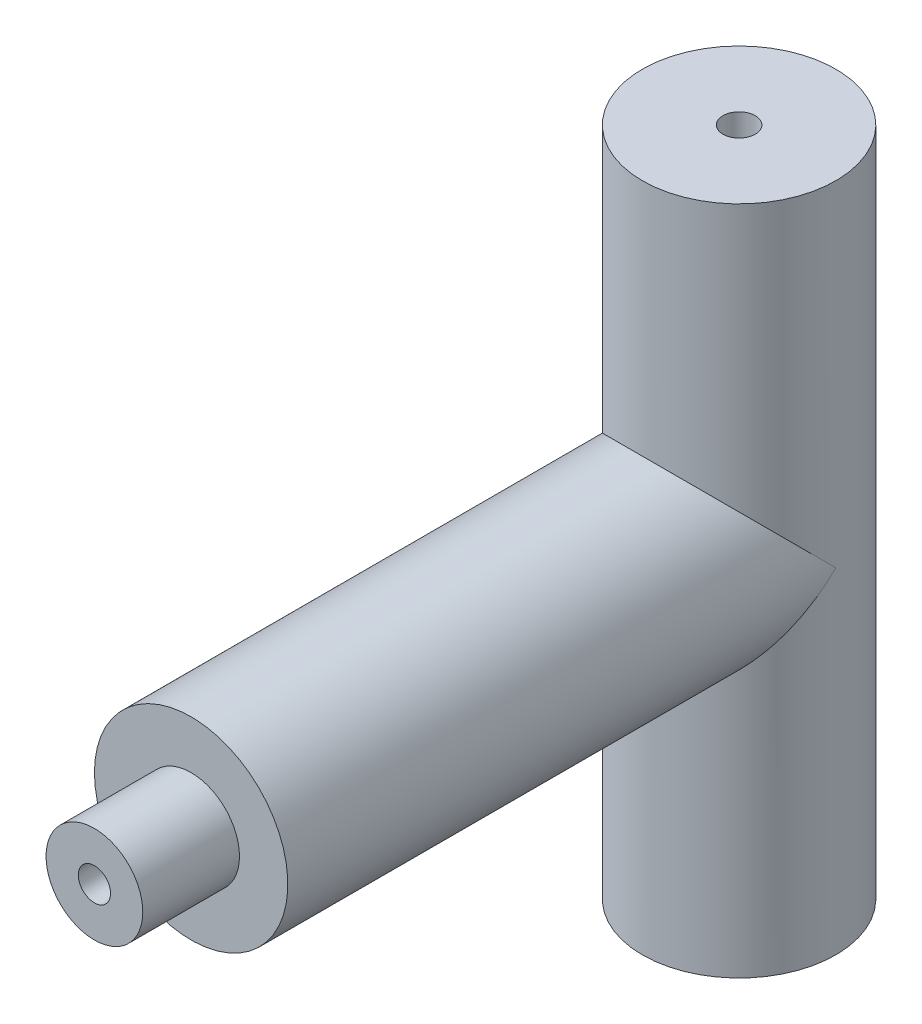
ISO-10303-21;
HEADER;
FILE_DESCRIPTION(('STEP AP214'),'2;1');
FILE_NAME('part.step','',(''),(''),'','','');
FILE_SCHEMA(('AUTOMOTIVE_DESIGN { 1 0 10303 214 1 1 1 1 }'));
ENDSEC;
DATA;
#1=APPLICATION_CONTEXT('core data for automotive mechanical design processes');
#2=APPLICATION_PROTOCOL_DEFINITION('international standard','automotive_design',2000,#1);
#3=PRODUCT_CONTEXT('',#1,'mechanical');
#4=PRODUCT('Part','Part','',(#3));
#5=PRODUCT_RELATED_PRODUCT_CATEGORY('part','',(#4));
#6=PRODUCT_DEFINITION_FORMATION('','',#4);
#7=PRODUCT_DEFINITION_CONTEXT('part definition',#1,'design');
#8=PRODUCT_DEFINITION('design','',#6,#7);
#9=PRODUCT_DEFINITION_SHAPE('','',#8);
#10=(LENGTH_UNIT() NAMED_UNIT(*) SI_UNIT(.MILLI.,.METRE.));
#11=(NAMED_UNIT(*) PLANE_ANGLE_UNIT() SI_UNIT($,.RADIAN.));
#12=(NAMED_UNIT(*) SI_UNIT($,.STERADIAN.) SOLID_ANGLE_UNIT());
#13=UNCERTAINTY_MEASURE_WITH_UNIT(LENGTH_MEASURE(1.E-05),#10,'distance_accuracy_value','');
#14=(GEOMETRIC_REPRESENTATION_CONTEXT(3) GLOBAL_UNCERTAINTY_ASSIGNED_CONTEXT((#13)) GLOBAL_UNIT_ASSIGNED_CONTEXT((#10,
#11,#12)) REPRESENTATION_CONTEXT('',''));
#15=CARTESIAN_POINT('',(0.,0.,0.));
#16=DIRECTION('',(0.,0.,1.));
#17=DIRECTION('',(1.,0.,0.));
#18=AXIS2_PLACEMENT_3D('',#15,#16,#17);
#19=CARTESIAN_POINT('',(0.,0.,-115.));
#20=DIRECTION('',(0.,0.,1.));
#21=DIRECTION('',(1.,0.,0.));
#22=AXIS2_PLACEMENT_3D('',#19,#20,#21);
#23=CYLINDRICAL_SURFACE('',#22,15.);
#24=CARTESIAN_POINT('',(0.,0.,-15.));
#25=DIRECTION('',(0.,0.,-1.));
#26=DIRECTION('',(-1.,0.,0.));
#27=AXIS2_PLACEMENT_3D('',#24,#25,#26);
#28=CIRCLE('',#27,15.);
#29=CARTESIAN_POINT('',(-15.,0.,-15.));
#30=VERTEX_POINT('',#29);
#31=EDGE_CURVE('E63',#30,#30,#28,.T.);
#32=ORIENTED_EDGE('',*,*,#31,.T.);
#33=EDGE_LOOP('',(#32));
#34=FACE_BOUND('',#33,.T.);
#35=CARTESIAN_POINT('',(0.,0.,-100.));
#36=DIRECTION('',(0.,-0.707106781186547,0.707106781186548));
#37=DIRECTION('',(0.,0.707106781186547,0.707106781186548));
#38=AXIS2_PLACEMENT_3D('',#35,#36,#37);
#39=ELLIPSE('',#38,21.2132034355964,15.);
#40=CARTESIAN_POINT('',(-15.,0.,-100.));
#41=VERTEX_POINT('',#40);
#42=CARTESIAN_POINT('',(15.,0.,-100.));
#43=VERTEX_POINT('',#42);
#44=EDGE_CURVE('E11',#41,#43,#39,.F.);
#45=ORIENTED_EDGE('',*,*,#44,.F.);
#46=CARTESIAN_POINT('',(0.,0.,-100.));
#47=DIRECTION('',(0.,0.707106781186547,0.707106781186548));
#48=DIRECTION('',(0.,-0.707106781186547,0.707106781186548));
#49=AXIS2_PLACEMENT_3D('',#46,#47,#48);
#50=ELLIPSE('',#49,21.2132034355964,15.);
#51=EDGE_CURVE('E45',#43,#41,#50,.F.);
#52=ORIENTED_EDGE('',*,*,#51,.F.);
#53=EDGE_LOOP('',(#45,#52));
#54=FACE_BOUND('',#53,.T.);
#55=ADVANCED_FACE('F37',(#34,#54),#23,.T.);
#56=CARTESIAN_POINT('',(0.,0.,-15.));
#57=DIRECTION('',(0.,0.,1.));
#58=DIRECTION('',(1.,0.,0.));
#59=AXIS2_PLACEMENT_3D('',#56,#57,#58);
#60=CYLINDRICAL_SURFACE('',#59,7.5);
#61=CARTESIAN_POINT('',(0.,0.,-15.));
#62=DIRECTION('',(0.,0.,1.));
#63=DIRECTION('',(1.,0.,0.));
#64=AXIS2_PLACEMENT_3D('',#61,#62,#63);
#65=CIRCLE('',#64,7.5);
#66=CARTESIAN_POINT('',(7.5,0.,-15.));
#67=VERTEX_POINT('',#66);
#68=EDGE_CURVE('E59',#67,#67,#65,.T.);
#69=ORIENTED_EDGE('',*,*,#68,.T.);
#70=EDGE_LOOP('',(#69));
#71=FACE_BOUND('',#70,.T.);
#72=CARTESIAN_POINT('',(0.,0.,0.));
#73=DIRECTION('',(0.,0.,1.));
#74=DIRECTION('',(1.,0.,0.));
#75=AXIS2_PLACEMENT_3D('',#72,#73,#74);
#76=CIRCLE('',#75,7.5);
#77=CARTESIAN_POINT('',(7.5,0.,0.));
#78=VERTEX_POINT('',#77);
#79=EDGE_CURVE('E54',#78,#78,#76,.T.);
#80=ORIENTED_EDGE('',*,*,#79,.F.);
#81=EDGE_LOOP('',(#80));
#82=FACE_BOUND('',#81,.T.);
#83=ADVANCED_FACE('F39',(#71,#82),#60,.T.);
#84=CARTESIAN_POINT('',(0.,0.,0.));
#85=DIRECTION('',(0.,0.,1.));
#86=DIRECTION('',(1.,0.,0.));
#87=AXIS2_PLACEMENT_3D('',#84,#85,#86);
#88=PLANE('',#87);
#89=CARTESIAN_POINT('',(0.,0.,0.));
#90=DIRECTION('',(0.,0.,1.));
#91=DIRECTION('',(1.,0.,0.));
#92=AXIS2_PLACEMENT_3D('',#89,#90,#91);
#93=CIRCLE('',#92,2.5);
#94=CARTESIAN_POINT('',(2.5,0.,0.));
#95=VERTEX_POINT('',#94);
#96=EDGE_CURVE('E62',#95,#95,#93,.T.);
#97=ORIENTED_EDGE('',*,*,#96,.F.);
#98=EDGE_LOOP('',(#97));
#99=FACE_BOUND('',#98,.T.);
#100=ORIENTED_EDGE('',*,*,#79,.T.);
#101=EDGE_LOOP('',(#100));
#102=FACE_BOUND('',#101,.T.);
#103=ADVANCED_FACE('F108',(#99,#102),#88,.T.);
#104=CARTESIAN_POINT('',(0.,0.,-5.));
#105=DIRECTION('',(0.,0.,1.));
#106=DIRECTION('',(1.,0.,0.));
#107=AXIS2_PLACEMENT_3D('',#104,#105,#106);
#108=CYLINDRICAL_SURFACE('',#107,2.5);
#109=CARTESIAN_POINT('',(0.,0.,-5.));
#110=DIRECTION('',(0.,0.,1.));
#111=DIRECTION('',(1.,0.,0.));
#112=AXIS2_PLACEMENT_3D('',#109,#110,#111);
#113=CIRCLE('',#112,2.5);
#114=CARTESIAN_POINT('',(2.5,0.,-5.));
#115=VERTEX_POINT('',#114);
#116=EDGE_CURVE('E56',#115,#115,#113,.T.);
#117=ORIENTED_EDGE('',*,*,#116,.F.);
#118=EDGE_LOOP('',(#117));
#119=FACE_BOUND('',#118,.T.);
#120=ORIENTED_EDGE('',*,*,#96,.T.);
#121=EDGE_LOOP('',(#120));
#122=FACE_BOUND('',#121,.T.);
#123=ADVANCED_FACE('F117',(#119,#122),#108,.F.);
#124=CARTESIAN_POINT('',(0.,0.,-5.));
#125=DIRECTION('',(0.,0.,1.));
#126=DIRECTION('',(1.,0.,0.));
#127=AXIS2_PLACEMENT_3D('',#124,#125,#126);
#128=PLANE('',#127);
#129=ORIENTED_EDGE('',*,*,#116,.T.);
#130=EDGE_LOOP('',(#129));
#131=FACE_BOUND('',#130,.T.);
#132=ADVANCED_FACE('F114',(#131),#128,.T.);
#133=CARTESIAN_POINT('',(0.,0.,-15.));
#134=DIRECTION('',(0.,0.,-1.));
#135=DIRECTION('',(-1.,0.,0.));
#136=AXIS2_PLACEMENT_3D('',#133,#134,#135);
#137=PLANE('',#136);
#138=ORIENTED_EDGE('',*,*,#68,.F.);
#139=EDGE_LOOP('',(#138));
#140=FACE_BOUND('',#139,.T.);
#141=ORIENTED_EDGE('',*,*,#31,.F.);
#142=EDGE_LOOP('',(#141));
#143=FACE_BOUND('',#142,.T.);
#144=ADVANCED_FACE('F112',(#140,#143),#137,.F.);
#145=CARTESIAN_POINT('',(0.,-52.,-100.));
#146=DIRECTION('',(0.,1.,0.));
#147=DIRECTION('',(0.,0.,1.));
#148=AXIS2_PLACEMENT_3D('',#145,#146,#147);
#149=PLANE('',#148);
#150=CARTESIAN_POINT('',(0.,-52.,-100.));
#151=DIRECTION('',(0.,-1.,0.));
#152=DIRECTION('',(0.,0.,-1.));
#153=AXIS2_PLACEMENT_3D('',#150,#151,#152);
#154=CIRCLE('',#153,2.5);
#155=CARTESIAN_POINT('',(0.,-52.,-102.5));
#156=VERTEX_POINT('',#155);
#157=EDGE_CURVE('E77',#156,#156,#154,.T.);
#158=ORIENTED_EDGE('',*,*,#157,.F.);
#159=EDGE_LOOP('',(#158));
#160=FACE_BOUND('',#159,.T.);
#161=CARTESIAN_POINT('',(0.,-52.,-100.));
#162=DIRECTION('',(0.,1.,0.));
#163=DIRECTION('',(0.,0.,1.));
#164=AXIS2_PLACEMENT_3D('',#161,#162,#163);
#165=CIRCLE('',#164,15.);
#166=CARTESIAN_POINT('',(0.,-52.,-85.));
#167=VERTEX_POINT('',#166);
#168=EDGE_CURVE('E71',#167,#167,#165,.T.);
#169=ORIENTED_EDGE('',*,*,#168,.F.);
#170=EDGE_LOOP('',(#169));
#171=FACE_BOUND('',#170,.T.);
#172=ADVANCED_FACE('F144',(#160,#171),#149,.F.);
#173=CARTESIAN_POINT('',(0.,-52.,-100.));
#174=DIRECTION('',(0.,1.,0.));
#175=DIRECTION('',(0.,0.,1.));
#176=AXIS2_PLACEMENT_3D('',#173,#174,#175);
#177=CYLINDRICAL_SURFACE('',#176,15.);
#178=ORIENTED_EDGE('',*,*,#44,.T.);
#179=ORIENTED_EDGE('',*,*,#51,.T.);
#180=EDGE_LOOP('',(#178,#179));
#181=FACE_BOUND('',#180,.T.);
#182=CARTESIAN_POINT('',(0.,52.,-100.));
#183=DIRECTION('',(0.,1.,0.));
#184=DIRECTION('',(0.,0.,1.));
#185=AXIS2_PLACEMENT_3D('',#182,#183,#184);
#186=CIRCLE('',#185,15.);
#187=CARTESIAN_POINT('',(0.,52.,-85.));
#188=VERTEX_POINT('',#187);
#189=EDGE_CURVE('E70',#188,#188,#186,.T.);
#190=ORIENTED_EDGE('',*,*,#189,.F.);
#191=EDGE_LOOP('',(#190));
#192=FACE_BOUND('',#191,.T.);
#193=ORIENTED_EDGE('',*,*,#168,.T.);
#194=EDGE_LOOP('',(#193));
#195=FACE_BOUND('',#194,.T.);
#196=ADVANCED_FACE('F52',(#181,#192,#195),#177,.T.);
#197=CARTESIAN_POINT('',(0.,52.,-100.));
#198=DIRECTION('',(0.,1.,0.));
#199=DIRECTION('',(0.,0.,1.));
#200=AXIS2_PLACEMENT_3D('',#197,#198,#199);
#201=PLANE('',#200);
#202=CARTESIAN_POINT('',(0.,52.,-100.));
#203=DIRECTION('',(0.,-1.,0.));
#204=DIRECTION('',(0.,0.,-1.));
#205=AXIS2_PLACEMENT_3D('',#202,#203,#204);
#206=CIRCLE('',#205,2.5);
#207=CARTESIAN_POINT('',(0.,52.,-102.5));
#208=VERTEX_POINT('',#207);
#209=EDGE_CURVE('E83',#208,#208,#206,.T.);
#210=ORIENTED_EDGE('',*,*,#209,.T.);
#211=EDGE_LOOP('',(#210));
#212=FACE_BOUND('',#211,.T.);
#213=ORIENTED_EDGE('',*,*,#189,.T.);
#214=EDGE_LOOP('',(#213));
#215=FACE_BOUND('',#214,.T.);
#216=ADVANCED_FACE('F152',(#212,#215),#201,.T.);
#217=CARTESIAN_POINT('',(0.,-47.,-100.));
#218=DIRECTION('',(0.,-1.,0.));
#219=DIRECTION('',(0.,0.,-1.));
#220=AXIS2_PLACEMENT_3D('',#217,#218,#219);
#221=CYLINDRICAL_SURFACE('',#220,2.5);
#222=CARTESIAN_POINT('',(0.,-47.,-100.));
#223=DIRECTION('',(0.,-1.,0.));
#224=DIRECTION('',(0.,0.,-1.));
#225=AXIS2_PLACEMENT_3D('',#222,#223,#224);
#226=CIRCLE('',#225,2.5);
#227=CARTESIAN_POINT('',(0.,-47.,-102.5));
#228=VERTEX_POINT('',#227);
#229=EDGE_CURVE('E74',#228,#228,#226,.T.);
#230=ORIENTED_EDGE('',*,*,#229,.F.);
#231=EDGE_LOOP('',(#230));
#232=FACE_BOUND('',#231,.T.);
#233=ORIENTED_EDGE('',*,*,#157,.T.);
#234=EDGE_LOOP('',(#233));
#235=FACE_BOUND('',#234,.T.);
#236=ADVANCED_FACE('F167',(#232,#235),#221,.F.);
#237=CARTESIAN_POINT('',(0.,-47.,-100.));
#238=DIRECTION('',(0.,-1.,0.));
#239=DIRECTION('',(0.,0.,-1.));
#240=AXIS2_PLACEMENT_3D('',#237,#238,#239);
#241=PLANE('',#240);
#242=ORIENTED_EDGE('',*,*,#229,.T.);
#243=EDGE_LOOP('',(#242));
#244=FACE_BOUND('',#243,.T.);
#245=ADVANCED_FACE('F98',(#244),#241,.T.);
#246=CARTESIAN_POINT('',(0.,47.,-100.));
#247=DIRECTION('',(0.,1.,0.));
#248=DIRECTION('',(0.,0.,1.));
#249=AXIS2_PLACEMENT_3D('',#246,#247,#248);
#250=CYLINDRICAL_SURFACE('',#249,2.5);
#251=CARTESIAN_POINT('',(0.,47.,-100.));
#252=DIRECTION('',(0.,-1.,0.));
#253=DIRECTION('',(0.,0.,-1.));
#254=AXIS2_PLACEMENT_3D('',#251,#252,#253);
#255=CIRCLE('',#254,2.5);
#256=CARTESIAN_POINT('',(0.,47.,-102.5));
#257=VERTEX_POINT('',#256);
#258=EDGE_CURVE('E80',#257,#257,#255,.T.);
#259=ORIENTED_EDGE('',*,*,#258,.T.);
#260=EDGE_LOOP('',(#259));
#261=FACE_BOUND('',#260,.T.);
#262=ORIENTED_EDGE('',*,*,#209,.F.);
#263=EDGE_LOOP('',(#262));
#264=FACE_BOUND('',#263,.T.);
#265=ADVANCED_FACE('F89',(#261,#264),#250,.F.);
#266=CARTESIAN_POINT('',(0.,47.,-100.));
#267=DIRECTION('',(0.,1.,0.));
#268=DIRECTION('',(0.,0.,-1.));
#269=AXIS2_PLACEMENT_3D('',#266,#267,#268);
#270=PLANE('',#269);
#271=ORIENTED_EDGE('',*,*,#258,.F.);
#272=EDGE_LOOP('',(#271));
#273=FACE_BOUND('',#272,.T.);
#274=ADVANCED_FACE('F92',(#273),#270,.T.);
#275=CLOSED_SHELL('',(#55,#83,#103,#123,#132,#144,#172,#196,#216,#236,#245,#265,#274));
#276=MANIFOLD_SOLID_BREP('B2',#275);
#277=ADVANCED_BREP_SHAPE_REPRESENTATION('',(#18,#276),#14);
#278=SHAPE_DEFINITION_REPRESENTATION(#9,#277);
ENDSEC;
END-ISO-10303-21;
